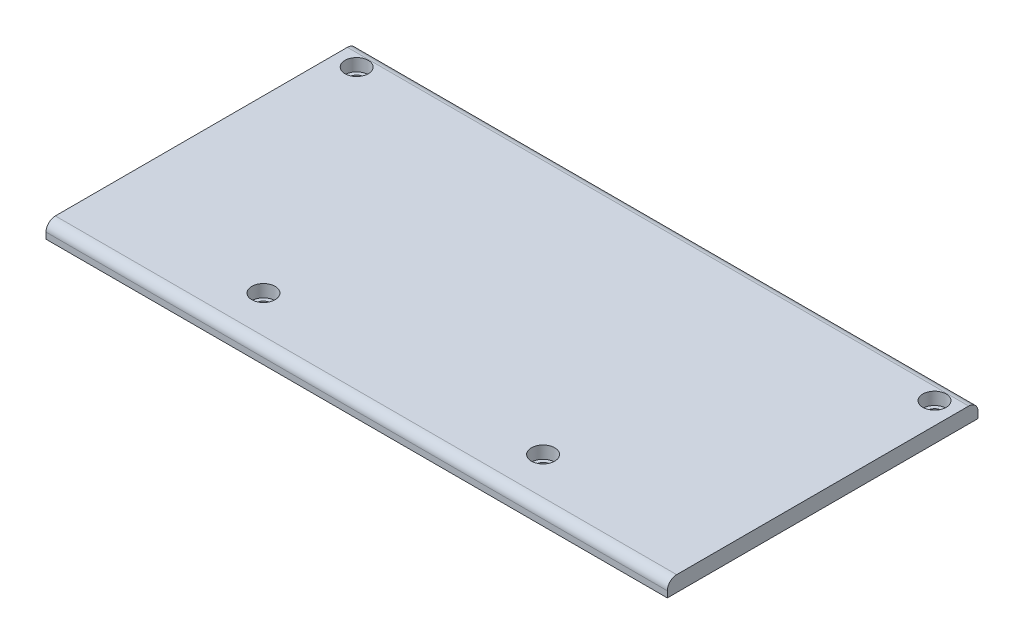
ISO-10303-21;
HEADER;
FILE_DESCRIPTION(('STEP AP214'),'2;1');
FILE_NAME('part.step','',(''),(''),'','','');
FILE_SCHEMA(('AUTOMOTIVE_DESIGN { 1 0 10303 214 1 1 1 1 }'));
ENDSEC;
DATA;
#1=APPLICATION_CONTEXT('core data for automotive mechanical design processes');
#2=APPLICATION_PROTOCOL_DEFINITION('international standard','automotive_design',2000,#1);
#3=PRODUCT_CONTEXT('',#1,'mechanical');
#4=PRODUCT('Part','Part','',(#3));
#5=PRODUCT_RELATED_PRODUCT_CATEGORY('part','',(#4));
#6=PRODUCT_DEFINITION_FORMATION('','',#4);
#7=PRODUCT_DEFINITION_CONTEXT('part definition',#1,'design');
#8=PRODUCT_DEFINITION('design','',#6,#7);
#9=PRODUCT_DEFINITION_SHAPE('','',#8);
#10=(LENGTH_UNIT() NAMED_UNIT(*) SI_UNIT(.MILLI.,.METRE.));
#11=(NAMED_UNIT(*) PLANE_ANGLE_UNIT() SI_UNIT($,.RADIAN.));
#12=(NAMED_UNIT(*) SI_UNIT($,.STERADIAN.) SOLID_ANGLE_UNIT());
#13=UNCERTAINTY_MEASURE_WITH_UNIT(LENGTH_MEASURE(1.E-05),#10,'distance_accuracy_value','');
#14=(GEOMETRIC_REPRESENTATION_CONTEXT(3) GLOBAL_UNCERTAINTY_ASSIGNED_CONTEXT((#13)) GLOBAL_UNIT_ASSIGNED_CONTEXT((#10,
#11,#12)) REPRESENTATION_CONTEXT('',''));
#15=CARTESIAN_POINT('',(0.,0.,0.));
#16=DIRECTION('',(0.,0.,1.));
#17=DIRECTION('',(1.,0.,0.));
#18=AXIS2_PLACEMENT_3D('',#15,#16,#17);
#19=CARTESIAN_POINT('',(-45.,0.,35.));
#20=DIRECTION('',(0.,1.,0.));
#21=DIRECTION('',(0.,0.,1.));
#22=AXIS2_PLACEMENT_3D('',#19,#20,#21);
#23=CYLINDRICAL_SURFACE('',#22,2.5);
#24=CARTESIAN_POINT('',(-45.,0.,35.));
#25=DIRECTION('',(0.,1.,0.));
#26=DIRECTION('',(0.,0.,1.));
#27=AXIS2_PLACEMENT_3D('',#24,#25,#26);
#28=CIRCLE('',#27,2.5);
#29=CARTESIAN_POINT('',(-45.,0.,37.5));
#30=VERTEX_POINT('',#29);
#31=EDGE_CURVE('E114',#30,#30,#28,.T.);
#32=ORIENTED_EDGE('',*,*,#31,.F.);
#33=EDGE_LOOP('',(#32));
#34=FACE_BOUND('',#33,.T.);
#35=CARTESIAN_POINT('',(-45.,1.,35.));
#36=DIRECTION('',(0.,1.,0.));
#37=DIRECTION('',(0.,0.,1.));
#38=AXIS2_PLACEMENT_3D('',#35,#36,#37);
#39=CIRCLE('',#38,2.5);
#40=CARTESIAN_POINT('',(-45.,1.,37.5));
#41=VERTEX_POINT('',#40);
#42=EDGE_CURVE('E138',#41,#41,#39,.F.);
#43=ORIENTED_EDGE('',*,*,#42,.F.);
#44=EDGE_LOOP('',(#43));
#45=FACE_BOUND('',#44,.T.);
#46=ADVANCED_FACE('F34',(#34,#45),#23,.F.);
#47=CARTESIAN_POINT('',(-93.,0.,-43.));
#48=DIRECTION('',(0.,1.,0.));
#49=DIRECTION('',(0.,0.,1.));
#50=AXIS2_PLACEMENT_3D('',#47,#48,#49);
#51=CYLINDRICAL_SURFACE('',#50,2.5);
#52=CARTESIAN_POINT('',(-93.,0.,-43.));
#53=DIRECTION('',(0.,1.,0.));
#54=DIRECTION('',(0.,0.,1.));
#55=AXIS2_PLACEMENT_3D('',#52,#53,#54);
#56=CIRCLE('',#55,2.5);
#57=CARTESIAN_POINT('',(-93.,0.,-40.5));
#58=VERTEX_POINT('',#57);
#59=EDGE_CURVE('E111',#58,#58,#56,.T.);
#60=ORIENTED_EDGE('',*,*,#59,.F.);
#61=EDGE_LOOP('',(#60));
#62=FACE_BOUND('',#61,.T.);
#63=CARTESIAN_POINT('',(-93.,1.,-43.));
#64=DIRECTION('',(0.,1.,0.));
#65=DIRECTION('',(0.,0.,1.));
#66=AXIS2_PLACEMENT_3D('',#63,#64,#65);
#67=CIRCLE('',#66,2.5);
#68=CARTESIAN_POINT('',(-93.,1.,-40.5));
#69=VERTEX_POINT('',#68);
#70=EDGE_CURVE('E128',#69,#69,#67,.F.);
#71=ORIENTED_EDGE('',*,*,#70,.F.);
#72=EDGE_LOOP('',(#71));
#73=FACE_BOUND('',#72,.T.);
#74=ADVANCED_FACE('F234',(#62,#73),#51,.F.);
#75=CARTESIAN_POINT('',(100.,5.,-50.));
#76=DIRECTION('',(-1.,0.,0.));
#77=DIRECTION('',(0.,0.,1.));
#78=AXIS2_PLACEMENT_3D('',#75,#76,#77);
#79=PLANE('',#78);
#80=DIRECTION('',(0.,0.,-1.));
#81=VECTOR('',#80,1.);
#82=CARTESIAN_POINT('',(100.,5.,-50.));
#83=LINE('',#82,#81);
#84=CARTESIAN_POINT('',(100.,5.,47.));
#85=VERTEX_POINT('',#84);
#86=CARTESIAN_POINT('',(100.,5.,-47.));
#87=VERTEX_POINT('',#86);
#88=EDGE_CURVE('E123',#85,#87,#83,.T.);
#89=ORIENTED_EDGE('',*,*,#88,.F.);
#90=CARTESIAN_POINT('',(100.,2.,47.));
#91=DIRECTION('',(-1.,0.,0.));
#92=DIRECTION('',(0.,0.,1.));
#93=AXIS2_PLACEMENT_3D('',#90,#91,#92);
#94=CIRCLE('',#93,3.);
#95=CARTESIAN_POINT('',(100.,2.,50.));
#96=VERTEX_POINT('',#95);
#97=EDGE_CURVE('E149',#85,#96,#94,.F.);
#98=ORIENTED_EDGE('',*,*,#97,.T.);
#99=DIRECTION('',(0.,-1.,0.));
#100=VECTOR('',#99,1.);
#101=CARTESIAN_POINT('',(100.,5.,50.));
#102=LINE('',#101,#100);
#103=CARTESIAN_POINT('',(100.,0.,50.));
#104=VERTEX_POINT('',#103);
#105=EDGE_CURVE('E109',#96,#104,#102,.T.);
#106=ORIENTED_EDGE('',*,*,#105,.T.);
#107=DIRECTION('',(0.,0.,-1.));
#108=VECTOR('',#107,1.);
#109=CARTESIAN_POINT('',(100.,0.,-50.));
#110=LINE('',#109,#108);
#111=CARTESIAN_POINT('',(100.,0.,-50.));
#112=VERTEX_POINT('',#111);
#113=EDGE_CURVE('E103',#104,#112,#110,.T.);
#114=ORIENTED_EDGE('',*,*,#113,.T.);
#115=DIRECTION('',(0.,-1.,0.));
#116=VECTOR('',#115,1.);
#117=CARTESIAN_POINT('',(100.,5.,-50.));
#118=LINE('',#117,#116);
#119=CARTESIAN_POINT('',(100.,2.,-50.));
#120=VERTEX_POINT('',#119);
#121=EDGE_CURVE('E87',#120,#112,#118,.T.);
#122=ORIENTED_EDGE('',*,*,#121,.F.);
#123=CARTESIAN_POINT('',(100.,2.,-47.));
#124=DIRECTION('',(-1.,0.,0.));
#125=DIRECTION('',(0.,0.,1.));
#126=AXIS2_PLACEMENT_3D('',#123,#124,#125);
#127=CIRCLE('',#126,3.);
#128=EDGE_CURVE('E147',#120,#87,#127,.F.);
#129=ORIENTED_EDGE('',*,*,#128,.T.);
#130=EDGE_LOOP('',(#89,#98,#106,#114,#122,#129));
#131=FACE_BOUND('',#130,.T.);
#132=ADVANCED_FACE('F108',(#131),#79,.F.);
#133=CARTESIAN_POINT('',(-100.,5.,-50.));
#134=DIRECTION('',(0.,0.,1.));
#135=DIRECTION('',(1.,0.,0.));
#136=AXIS2_PLACEMENT_3D('',#133,#134,#135);
#137=PLANE('',#136);
#138=DIRECTION('',(0.,-1.,0.));
#139=VECTOR('',#138,1.);
#140=CARTESIAN_POINT('',(-100.,5.,-50.));
#141=LINE('',#140,#139);
#142=CARTESIAN_POINT('',(-100.,2.,-50.));
#143=VERTEX_POINT('',#142);
#144=CARTESIAN_POINT('',(-100.,0.,-50.));
#145=VERTEX_POINT('',#144);
#146=EDGE_CURVE('E97',#143,#145,#141,.T.);
#147=ORIENTED_EDGE('',*,*,#146,.F.);
#148=DIRECTION('',(-1.,0.,0.));
#149=VECTOR('',#148,1.);
#150=CARTESIAN_POINT('',(100.,2.,-50.));
#151=LINE('',#150,#149);
#152=EDGE_CURVE('E11',#143,#120,#151,.F.);
#153=ORIENTED_EDGE('',*,*,#152,.T.);
#154=ORIENTED_EDGE('',*,*,#121,.T.);
#155=DIRECTION('',(-1.,0.,0.));
#156=VECTOR('',#155,1.);
#157=CARTESIAN_POINT('',(-100.,0.,-50.));
#158=LINE('',#157,#156);
#159=EDGE_CURVE('E90',#112,#145,#158,.T.);
#160=ORIENTED_EDGE('',*,*,#159,.T.);
#161=EDGE_LOOP('',(#147,#153,#154,#160));
#162=FACE_BOUND('',#161,.T.);
#163=ADVANCED_FACE('F89',(#162),#137,.F.);
#164=CARTESIAN_POINT('',(-100.,5.,-50.));
#165=DIRECTION('',(1.,0.,0.));
#166=DIRECTION('',(0.,0.,-1.));
#167=AXIS2_PLACEMENT_3D('',#164,#165,#166);
#168=PLANE('',#167);
#169=DIRECTION('',(0.,-1.,0.));
#170=VECTOR('',#169,1.);
#171=CARTESIAN_POINT('',(-100.,5.,50.));
#172=LINE('',#171,#170);
#173=CARTESIAN_POINT('',(-100.,2.,50.));
#174=VERTEX_POINT('',#173);
#175=CARTESIAN_POINT('',(-100.,0.,50.));
#176=VERTEX_POINT('',#175);
#177=EDGE_CURVE('E125',#174,#176,#172,.T.);
#178=ORIENTED_EDGE('',*,*,#177,.F.);
#179=CARTESIAN_POINT('',(-100.,2.,47.));
#180=DIRECTION('',(1.,0.,0.));
#181=DIRECTION('',(0.,0.,-1.));
#182=AXIS2_PLACEMENT_3D('',#179,#180,#181);
#183=CIRCLE('',#182,3.);
#184=CARTESIAN_POINT('',(-100.,5.,47.));
#185=VERTEX_POINT('',#184);
#186=EDGE_CURVE('E42',#174,#185,#183,.F.);
#187=ORIENTED_EDGE('',*,*,#186,.T.);
#188=DIRECTION('',(0.,0.,1.));
#189=VECTOR('',#188,1.);
#190=CARTESIAN_POINT('',(-100.,5.,-50.));
#191=LINE('',#190,#189);
#192=CARTESIAN_POINT('',(-100.,5.,-47.));
#193=VERTEX_POINT('',#192);
#194=EDGE_CURVE('E117',#193,#185,#191,.T.);
#195=ORIENTED_EDGE('',*,*,#194,.F.);
#196=CARTESIAN_POINT('',(-100.,2.,-47.));
#197=DIRECTION('',(1.,0.,0.));
#198=DIRECTION('',(0.,0.,-1.));
#199=AXIS2_PLACEMENT_3D('',#196,#197,#198);
#200=CIRCLE('',#199,3.);
#201=EDGE_CURVE('E49',#193,#143,#200,.F.);
#202=ORIENTED_EDGE('',*,*,#201,.T.);
#203=ORIENTED_EDGE('',*,*,#146,.T.);
#204=DIRECTION('',(0.,0.,1.));
#205=VECTOR('',#204,1.);
#206=CARTESIAN_POINT('',(-100.,0.,-50.));
#207=LINE('',#206,#205);
#208=EDGE_CURVE('E105',#145,#176,#207,.T.);
#209=ORIENTED_EDGE('',*,*,#208,.T.);
#210=EDGE_LOOP('',(#178,#187,#195,#202,#203,#209));
#211=FACE_BOUND('',#210,.T.);
#212=ADVANCED_FACE('F154',(#211),#168,.F.);
#213=CARTESIAN_POINT('',(-100.,5.,50.));
#214=DIRECTION('',(0.,0.,-1.));
#215=DIRECTION('',(-1.,0.,0.));
#216=AXIS2_PLACEMENT_3D('',#213,#214,#215);
#217=PLANE('',#216);
#218=ORIENTED_EDGE('',*,*,#105,.F.);
#219=DIRECTION('',(1.,0.,0.));
#220=VECTOR('',#219,1.);
#221=CARTESIAN_POINT('',(-100.,2.,50.));
#222=LINE('',#221,#220);
#223=EDGE_CURVE('E57',#96,#174,#222,.F.);
#224=ORIENTED_EDGE('',*,*,#223,.T.);
#225=ORIENTED_EDGE('',*,*,#177,.T.);
#226=DIRECTION('',(1.,0.,0.));
#227=VECTOR('',#226,1.);
#228=CARTESIAN_POINT('',(-100.,0.,50.));
#229=LINE('',#228,#227);
#230=EDGE_CURVE('E121',#176,#104,#229,.T.);
#231=ORIENTED_EDGE('',*,*,#230,.T.);
#232=EDGE_LOOP('',(#218,#224,#225,#231));
#233=FACE_BOUND('',#232,.T.);
#234=ADVANCED_FACE('F162',(#233),#217,.F.);
#235=CARTESIAN_POINT('',(0.,5.,0.));
#236=DIRECTION('',(0.,1.,0.));
#237=DIRECTION('',(0.,0.,1.));
#238=AXIS2_PLACEMENT_3D('',#235,#236,#237);
#239=PLANE('',#238);
#240=CARTESIAN_POINT('',(-93.,5.,-43.));
#241=DIRECTION('',(0.,1.,0.));
#242=DIRECTION('',(0.,0.,1.));
#243=AXIS2_PLACEMENT_3D('',#240,#241,#242);
#244=CIRCLE('',#243,3.75000000000001);
#245=CARTESIAN_POINT('',(-93.,5.,-39.25));
#246=VERTEX_POINT('',#245);
#247=EDGE_CURVE('E190',#246,#246,#244,.T.);
#248=ORIENTED_EDGE('',*,*,#247,.F.);
#249=EDGE_LOOP('',(#248));
#250=FACE_BOUND('',#249,.T.);
#251=CARTESIAN_POINT('',(-45.,5.,35.));
#252=DIRECTION('',(0.,1.,0.));
#253=DIRECTION('',(0.,0.,1.));
#254=AXIS2_PLACEMENT_3D('',#251,#252,#253);
#255=CIRCLE('',#254,3.75);
#256=CARTESIAN_POINT('',(-45.,5.,38.75));
#257=VERTEX_POINT('',#256);
#258=EDGE_CURVE('E184',#257,#257,#255,.T.);
#259=ORIENTED_EDGE('',*,*,#258,.F.);
#260=EDGE_LOOP('',(#259));
#261=FACE_BOUND('',#260,.T.);
#262=CARTESIAN_POINT('',(45.,5.,35.));
#263=DIRECTION('',(0.,1.,0.));
#264=DIRECTION('',(0.,0.,-1.));
#265=AXIS2_PLACEMENT_3D('',#262,#263,#264);
#266=CIRCLE('',#265,3.75);
#267=CARTESIAN_POINT('',(45.,5.,31.25));
#268=VERTEX_POINT('',#267);
#269=EDGE_CURVE('E178',#268,#268,#266,.T.);
#270=ORIENTED_EDGE('',*,*,#269,.F.);
#271=EDGE_LOOP('',(#270));
#272=FACE_BOUND('',#271,.T.);
#273=CARTESIAN_POINT('',(93.,5.,-43.));
#274=DIRECTION('',(0.,1.,0.));
#275=DIRECTION('',(0.,0.,-1.));
#276=AXIS2_PLACEMENT_3D('',#273,#274,#275);
#277=CIRCLE('',#276,3.75000000000001);
#278=CARTESIAN_POINT('',(93.,5.,-46.75));
#279=VERTEX_POINT('',#278);
#280=EDGE_CURVE('E172',#279,#279,#277,.T.);
#281=ORIENTED_EDGE('',*,*,#280,.F.);
#282=EDGE_LOOP('',(#281));
#283=FACE_BOUND('',#282,.T.);
#284=ORIENTED_EDGE('',*,*,#194,.T.);
#285=DIRECTION('',(1.,0.,0.));
#286=VECTOR('',#285,1.);
#287=CARTESIAN_POINT('',(100.,5.,47.));
#288=LINE('',#287,#286);
#289=EDGE_CURVE('E144',#185,#85,#288,.T.);
#290=ORIENTED_EDGE('',*,*,#289,.T.);
#291=ORIENTED_EDGE('',*,*,#88,.T.);
#292=DIRECTION('',(-1.,0.,0.));
#293=VECTOR('',#292,1.);
#294=CARTESIAN_POINT('',(-100.,5.,-47.));
#295=LINE('',#294,#293);
#296=EDGE_CURVE('E96',#87,#193,#295,.T.);
#297=ORIENTED_EDGE('',*,*,#296,.T.);
#298=EDGE_LOOP('',(#284,#290,#291,#297));
#299=FACE_BOUND('',#298,.T.);
#300=ADVANCED_FACE('F158',(#250,#261,#272,#283,#299),#239,.T.);
#301=CARTESIAN_POINT('',(0.,0.,0.));
#302=DIRECTION('',(0.,1.,0.));
#303=DIRECTION('',(0.,0.,1.));
#304=AXIS2_PLACEMENT_3D('',#301,#302,#303);
#305=PLANE('',#304);
#306=ORIENTED_EDGE('',*,*,#59,.T.);
#307=EDGE_LOOP('',(#306));
#308=FACE_BOUND('',#307,.T.);
#309=CARTESIAN_POINT('',(45.,0.,35.));
#310=DIRECTION('',(0.,1.,0.));
#311=DIRECTION('',(0.,0.,-1.));
#312=AXIS2_PLACEMENT_3D('',#309,#310,#311);
#313=CIRCLE('',#312,2.5);
#314=CARTESIAN_POINT('',(45.,0.,32.5));
#315=VERTEX_POINT('',#314);
#316=EDGE_CURVE('E141',#315,#315,#313,.T.);
#317=ORIENTED_EDGE('',*,*,#316,.T.);
#318=EDGE_LOOP('',(#317));
#319=FACE_BOUND('',#318,.T.);
#320=CARTESIAN_POINT('',(93.,0.,-43.));
#321=DIRECTION('',(0.,1.,0.));
#322=DIRECTION('',(0.,0.,-1.));
#323=AXIS2_PLACEMENT_3D('',#320,#321,#322);
#324=CIRCLE('',#323,2.5);
#325=CARTESIAN_POINT('',(93.,0.,-45.5));
#326=VERTEX_POINT('',#325);
#327=EDGE_CURVE('E165',#326,#326,#324,.T.);
#328=ORIENTED_EDGE('',*,*,#327,.T.);
#329=EDGE_LOOP('',(#328));
#330=FACE_BOUND('',#329,.T.);
#331=ORIENTED_EDGE('',*,*,#31,.T.);
#332=EDGE_LOOP('',(#331));
#333=FACE_BOUND('',#332,.T.);
#334=ORIENTED_EDGE('',*,*,#113,.F.);
#335=ORIENTED_EDGE('',*,*,#230,.F.);
#336=ORIENTED_EDGE('',*,*,#208,.F.);
#337=ORIENTED_EDGE('',*,*,#159,.F.);
#338=EDGE_LOOP('',(#334,#335,#336,#337));
#339=FACE_BOUND('',#338,.T.);
#340=ADVANCED_FACE('F101',(#308,#319,#330,#333,#339),#305,.F.);
#341=CARTESIAN_POINT('',(93.,0.,-43.));
#342=DIRECTION('',(0.,1.,0.));
#343=DIRECTION('',(0.,0.,1.));
#344=AXIS2_PLACEMENT_3D('',#341,#342,#343);
#345=CYLINDRICAL_SURFACE('',#344,2.5);
#346=CARTESIAN_POINT('',(93.,1.,-43.));
#347=DIRECTION('',(0.,-1.,0.));
#348=DIRECTION('',(0.,0.,-1.));
#349=AXIS2_PLACEMENT_3D('',#346,#347,#348);
#350=CIRCLE('',#349,2.5);
#351=CARTESIAN_POINT('',(93.,1.,-45.5));
#352=VERTEX_POINT('',#351);
#353=EDGE_CURVE('E135',#352,#352,#350,.F.);
#354=ORIENTED_EDGE('',*,*,#353,.T.);
#355=EDGE_LOOP('',(#354));
#356=FACE_BOUND('',#355,.T.);
#357=ORIENTED_EDGE('',*,*,#327,.F.);
#358=EDGE_LOOP('',(#357));
#359=FACE_BOUND('',#358,.T.);
#360=ADVANCED_FACE('F246',(#356,#359),#345,.F.);
#361=CARTESIAN_POINT('',(45.,0.,35.));
#362=DIRECTION('',(0.,1.,0.));
#363=DIRECTION('',(0.,0.,1.));
#364=AXIS2_PLACEMENT_3D('',#361,#362,#363);
#365=CYLINDRICAL_SURFACE('',#364,2.5);
#366=CARTESIAN_POINT('',(45.,1.,35.));
#367=DIRECTION('',(0.,-1.,0.));
#368=DIRECTION('',(0.,0.,-1.));
#369=AXIS2_PLACEMENT_3D('',#366,#367,#368);
#370=CIRCLE('',#369,2.5);
#371=CARTESIAN_POINT('',(45.,1.,32.5));
#372=VERTEX_POINT('',#371);
#373=EDGE_CURVE('E131',#372,#372,#370,.F.);
#374=ORIENTED_EDGE('',*,*,#373,.T.);
#375=EDGE_LOOP('',(#374));
#376=FACE_BOUND('',#375,.T.);
#377=ORIENTED_EDGE('',*,*,#316,.F.);
#378=EDGE_LOOP('',(#377));
#379=FACE_BOUND('',#378,.T.);
#380=ADVANCED_FACE('F245',(#376,#379),#365,.F.);
#381=CARTESIAN_POINT('',(-93.,1.,-43.));
#382=DIRECTION('',(0.,1.,0.));
#383=DIRECTION('',(0.,0.,1.));
#384=AXIS2_PLACEMENT_3D('',#381,#382,#383);
#385=PLANE('',#384);
#386=CARTESIAN_POINT('',(-93.,1.,-43.));
#387=DIRECTION('',(0.,1.,0.));
#388=DIRECTION('',(0.,0.,1.));
#389=AXIS2_PLACEMENT_3D('',#386,#387,#388);
#390=CIRCLE('',#389,3.75000000000001);
#391=CARTESIAN_POINT('',(-93.,1.,-39.25));
#392=VERTEX_POINT('',#391);
#393=EDGE_CURVE('E132',#392,#392,#390,.T.);
#394=ORIENTED_EDGE('',*,*,#393,.T.);
#395=EDGE_LOOP('',(#394));
#396=FACE_BOUND('',#395,.T.);
#397=ORIENTED_EDGE('',*,*,#70,.T.);
#398=EDGE_LOOP('',(#397));
#399=FACE_BOUND('',#398,.T.);
#400=ADVANCED_FACE('F196',(#396,#399),#385,.T.);
#401=CARTESIAN_POINT('',(-93.,1.,-43.));
#402=DIRECTION('',(0.,1.,0.));
#403=DIRECTION('',(0.,0.,1.));
#404=AXIS2_PLACEMENT_3D('',#401,#402,#403);
#405=CYLINDRICAL_SURFACE('',#404,3.75000000000001);
#406=ORIENTED_EDGE('',*,*,#393,.F.);
#407=EDGE_LOOP('',(#406));
#408=FACE_BOUND('',#407,.T.);
#409=ORIENTED_EDGE('',*,*,#247,.T.);
#410=EDGE_LOOP('',(#409));
#411=FACE_BOUND('',#410,.T.);
#412=ADVANCED_FACE('F199',(#408,#411),#405,.F.);
#413=CARTESIAN_POINT('',(45.,1.,35.));
#414=DIRECTION('',(0.,-1.,0.));
#415=DIRECTION('',(0.,0.,-1.));
#416=AXIS2_PLACEMENT_3D('',#413,#414,#415);
#417=PLANE('',#416);
#418=CARTESIAN_POINT('',(45.,1.,35.));
#419=DIRECTION('',(0.,1.,0.));
#420=DIRECTION('',(0.,0.,-1.));
#421=AXIS2_PLACEMENT_3D('',#418,#419,#420);
#422=CIRCLE('',#421,3.75);
#423=CARTESIAN_POINT('',(45.,1.,31.25));
#424=VERTEX_POINT('',#423);
#425=EDGE_CURVE('E181',#424,#424,#422,.T.);
#426=ORIENTED_EDGE('',*,*,#425,.T.);
#427=EDGE_LOOP('',(#426));
#428=FACE_BOUND('',#427,.T.);
#429=ORIENTED_EDGE('',*,*,#373,.F.);
#430=EDGE_LOOP('',(#429));
#431=FACE_BOUND('',#430,.T.);
#432=ADVANCED_FACE('F202',(#428,#431),#417,.F.);
#433=CARTESIAN_POINT('',(45.,1.,35.));
#434=DIRECTION('',(0.,1.,0.));
#435=DIRECTION('',(0.,0.,1.));
#436=AXIS2_PLACEMENT_3D('',#433,#434,#435);
#437=CYLINDRICAL_SURFACE('',#436,3.75);
#438=ORIENTED_EDGE('',*,*,#425,.F.);
#439=EDGE_LOOP('',(#438));
#440=FACE_BOUND('',#439,.T.);
#441=ORIENTED_EDGE('',*,*,#269,.T.);
#442=EDGE_LOOP('',(#441));
#443=FACE_BOUND('',#442,.T.);
#444=ADVANCED_FACE('F228',(#440,#443),#437,.F.);
#445=CARTESIAN_POINT('',(93.,1.,-43.));
#446=DIRECTION('',(0.,-1.,0.));
#447=DIRECTION('',(0.,0.,-1.));
#448=AXIS2_PLACEMENT_3D('',#445,#446,#447);
#449=PLANE('',#448);
#450=CARTESIAN_POINT('',(93.,1.,-43.));
#451=DIRECTION('',(0.,1.,0.));
#452=DIRECTION('',(0.,0.,-1.));
#453=AXIS2_PLACEMENT_3D('',#450,#451,#452);
#454=CIRCLE('',#453,3.75000000000001);
#455=CARTESIAN_POINT('',(93.,1.,-46.75));
#456=VERTEX_POINT('',#455);
#457=EDGE_CURVE('E175',#456,#456,#454,.T.);
#458=ORIENTED_EDGE('',*,*,#457,.T.);
#459=EDGE_LOOP('',(#458));
#460=FACE_BOUND('',#459,.T.);
#461=ORIENTED_EDGE('',*,*,#353,.F.);
#462=EDGE_LOOP('',(#461));
#463=FACE_BOUND('',#462,.T.);
#464=ADVANCED_FACE('F218',(#460,#463),#449,.F.);
#465=CARTESIAN_POINT('',(93.,1.,-43.));
#466=DIRECTION('',(0.,1.,0.));
#467=DIRECTION('',(0.,0.,1.));
#468=AXIS2_PLACEMENT_3D('',#465,#466,#467);
#469=CYLINDRICAL_SURFACE('',#468,3.75000000000001);
#470=ORIENTED_EDGE('',*,*,#457,.F.);
#471=EDGE_LOOP('',(#470));
#472=FACE_BOUND('',#471,.T.);
#473=ORIENTED_EDGE('',*,*,#280,.T.);
#474=EDGE_LOOP('',(#473));
#475=FACE_BOUND('',#474,.T.);
#476=ADVANCED_FACE('F215',(#472,#475),#469,.F.);
#477=CARTESIAN_POINT('',(-45.,1.,35.));
#478=DIRECTION('',(0.,1.,0.));
#479=DIRECTION('',(0.,0.,1.));
#480=AXIS2_PLACEMENT_3D('',#477,#478,#479);
#481=PLANE('',#480);
#482=CARTESIAN_POINT('',(-45.,1.,35.));
#483=DIRECTION('',(0.,1.,0.));
#484=DIRECTION('',(0.,0.,1.));
#485=AXIS2_PLACEMENT_3D('',#482,#483,#484);
#486=CIRCLE('',#485,3.75);
#487=CARTESIAN_POINT('',(-45.,1.,38.75));
#488=VERTEX_POINT('',#487);
#489=EDGE_CURVE('E187',#488,#488,#486,.T.);
#490=ORIENTED_EDGE('',*,*,#489,.T.);
#491=EDGE_LOOP('',(#490));
#492=FACE_BOUND('',#491,.T.);
#493=ORIENTED_EDGE('',*,*,#42,.T.);
#494=EDGE_LOOP('',(#493));
#495=FACE_BOUND('',#494,.T.);
#496=ADVANCED_FACE('F217',(#492,#495),#481,.T.);
#497=CARTESIAN_POINT('',(-45.,1.,35.));
#498=DIRECTION('',(0.,1.,0.));
#499=DIRECTION('',(0.,0.,1.));
#500=AXIS2_PLACEMENT_3D('',#497,#498,#499);
#501=CYLINDRICAL_SURFACE('',#500,3.75);
#502=ORIENTED_EDGE('',*,*,#489,.F.);
#503=EDGE_LOOP('',(#502));
#504=FACE_BOUND('',#503,.T.);
#505=ORIENTED_EDGE('',*,*,#258,.T.);
#506=EDGE_LOOP('',(#505));
#507=FACE_BOUND('',#506,.T.);
#508=ADVANCED_FACE('F225',(#504,#507),#501,.F.);
#509=CARTESIAN_POINT('',(0.,2.,47.));
#510=DIRECTION('',(-1.,0.,0.));
#511=DIRECTION('',(0.,0.,1.));
#512=AXIS2_PLACEMENT_3D('',#509,#510,#511);
#513=CYLINDRICAL_SURFACE('',#512,3.);
#514=ORIENTED_EDGE('',*,*,#186,.F.);
#515=ORIENTED_EDGE('',*,*,#223,.F.);
#516=ORIENTED_EDGE('',*,*,#97,.F.);
#517=ORIENTED_EDGE('',*,*,#289,.F.);
#518=EDGE_LOOP('',(#514,#515,#516,#517));
#519=FACE_BOUND('',#518,.T.);
#520=ADVANCED_FACE('F161',(#519),#513,.T.);
#521=CARTESIAN_POINT('',(0.,2.,-47.));
#522=DIRECTION('',(1.,0.,0.));
#523=DIRECTION('',(0.,0.,-1.));
#524=AXIS2_PLACEMENT_3D('',#521,#522,#523);
#525=CYLINDRICAL_SURFACE('',#524,3.);
#526=ORIENTED_EDGE('',*,*,#128,.F.);
#527=ORIENTED_EDGE('',*,*,#152,.F.);
#528=ORIENTED_EDGE('',*,*,#201,.F.);
#529=ORIENTED_EDGE('',*,*,#296,.F.);
#530=EDGE_LOOP('',(#526,#527,#528,#529));
#531=FACE_BOUND('',#530,.T.);
#532=ADVANCED_FACE('F36',(#531),#525,.T.);
#533=CLOSED_SHELL('',(#46,#74,#132,#163,#212,#234,#300,#340,#360,#380,#400,#412,#432,#444,#464,
#476,#496,#508,#520,#532));
#534=MANIFOLD_SOLID_BREP('B2',#533);
#535=ADVANCED_BREP_SHAPE_REPRESENTATION('',(#18,#534),#14);
#536=SHAPE_DEFINITION_REPRESENTATION(#9,#535);
ENDSEC;
END-ISO-10303-21;
